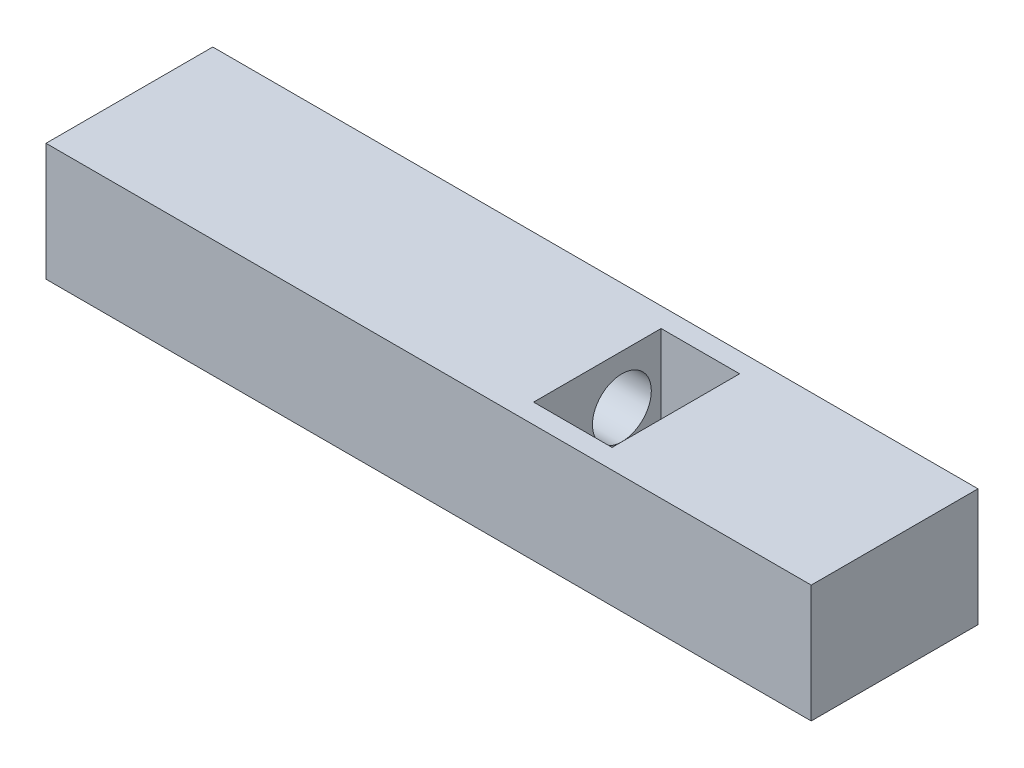
ISO-10303-21;
HEADER;
FILE_DESCRIPTION(('STEP AP214'),'2;1');
FILE_NAME('part.step','',(''),(''),'','','');
FILE_SCHEMA(('AUTOMOTIVE_DESIGN { 1 0 10303 214 1 1 1 1 }'));
ENDSEC;
DATA;
#1=APPLICATION_CONTEXT('core data for automotive mechanical design processes');
#2=APPLICATION_PROTOCOL_DEFINITION('international standard','automotive_design',2000,#1);
#3=PRODUCT_CONTEXT('',#1,'mechanical');
#4=PRODUCT('Part','Part','',(#3));
#5=PRODUCT_RELATED_PRODUCT_CATEGORY('part','',(#4));
#6=PRODUCT_DEFINITION_FORMATION('','',#4);
#7=PRODUCT_DEFINITION_CONTEXT('part definition',#1,'design');
#8=PRODUCT_DEFINITION('design','',#6,#7);
#9=PRODUCT_DEFINITION_SHAPE('','',#8);
#10=(LENGTH_UNIT() NAMED_UNIT(*) SI_UNIT(.MILLI.,.METRE.));
#11=(NAMED_UNIT(*) PLANE_ANGLE_UNIT() SI_UNIT($,.RADIAN.));
#12=(NAMED_UNIT(*) SI_UNIT($,.STERADIAN.) SOLID_ANGLE_UNIT());
#13=UNCERTAINTY_MEASURE_WITH_UNIT(LENGTH_MEASURE(1.E-05),#10,'distance_accuracy_value','');
#14=(GEOMETRIC_REPRESENTATION_CONTEXT(3) GLOBAL_UNCERTAINTY_ASSIGNED_CONTEXT((#13)) GLOBAL_UNIT_ASSIGNED_CONTEXT((#10,
#11,#12)) REPRESENTATION_CONTEXT('',''));
#15=CARTESIAN_POINT('',(0.,0.,0.));
#16=DIRECTION('',(0.,0.,1.));
#17=DIRECTION('',(1.,0.,0.));
#18=AXIS2_PLACEMENT_3D('',#15,#16,#17);
#19=CARTESIAN_POINT('',(0.,6.,0.));
#20=DIRECTION('',(1.,0.,0.));
#21=DIRECTION('',(0.,0.,1.));
#22=AXIS2_PLACEMENT_3D('',#19,#20,#21);
#23=PLANE('',#22);
#24=DIRECTION('',(0.,0.,-1.));
#25=VECTOR('',#24,1.);
#26=CARTESIAN_POINT('',(0.,0.,0.));
#27=LINE('',#26,#25);
#28=CARTESIAN_POINT('',(0.,0.,8.5));
#29=VERTEX_POINT('',#28);
#30=CARTESIAN_POINT('',(0.,0.,0.));
#31=VERTEX_POINT('',#30);
#32=EDGE_CURVE('E154',#29,#31,#27,.T.);
#33=ORIENTED_EDGE('',*,*,#32,.F.);
#34=DIRECTION('',(0.,-1.,0.));
#35=VECTOR('',#34,1.);
#36=CARTESIAN_POINT('',(0.,6.,8.5));
#37=LINE('',#36,#35);
#38=CARTESIAN_POINT('',(0.,6.,8.5));
#39=VERTEX_POINT('',#38);
#40=EDGE_CURVE('E164',#39,#29,#37,.T.);
#41=ORIENTED_EDGE('',*,*,#40,.F.);
#42=DIRECTION('',(0.,0.,-1.));
#43=VECTOR('',#42,1.);
#44=CARTESIAN_POINT('',(0.,6.,0.));
#45=LINE('',#44,#43);
#46=CARTESIAN_POINT('',(0.,6.,0.));
#47=VERTEX_POINT('',#46);
#48=EDGE_CURVE('E156',#39,#47,#45,.T.);
#49=ORIENTED_EDGE('',*,*,#48,.T.);
#50=DIRECTION('',(0.,-1.,0.));
#51=VECTOR('',#50,1.);
#52=CARTESIAN_POINT('',(0.,6.,0.));
#53=LINE('',#52,#51);
#54=EDGE_CURVE('E11',#47,#31,#53,.T.);
#55=ORIENTED_EDGE('',*,*,#54,.T.);
#56=EDGE_LOOP('',(#33,#41,#49,#55));
#57=FACE_BOUND('',#56,.T.);
#58=ADVANCED_FACE('F45',(#57),#23,.F.);
#59=CARTESIAN_POINT('',(0.,6.,0.));
#60=DIRECTION('',(0.,0.,1.));
#61=DIRECTION('',(-1.,0.,0.));
#62=AXIS2_PLACEMENT_3D('',#59,#60,#61);
#63=PLANE('',#62);
#64=DIRECTION('',(1.,0.,0.));
#65=VECTOR('',#64,1.);
#66=CARTESIAN_POINT('',(0.,0.,0.));
#67=LINE('',#66,#65);
#68=CARTESIAN_POINT('',(39.,0.,0.));
#69=VERTEX_POINT('',#68);
#70=EDGE_CURVE('E166',#31,#69,#67,.T.);
#71=ORIENTED_EDGE('',*,*,#70,.F.);
#72=ORIENTED_EDGE('',*,*,#54,.F.);
#73=DIRECTION('',(1.,0.,0.));
#74=VECTOR('',#73,1.);
#75=CARTESIAN_POINT('',(0.,6.,0.));
#76=LINE('',#75,#74);
#77=CARTESIAN_POINT('',(39.,6.,0.));
#78=VERTEX_POINT('',#77);
#79=EDGE_CURVE('E96',#47,#78,#76,.T.);
#80=ORIENTED_EDGE('',*,*,#79,.T.);
#81=DIRECTION('',(0.,-1.,0.));
#82=VECTOR('',#81,1.);
#83=CARTESIAN_POINT('',(39.,6.,0.));
#84=LINE('',#83,#82);
#85=EDGE_CURVE('E53',#78,#69,#84,.T.);
#86=ORIENTED_EDGE('',*,*,#85,.T.);
#87=EDGE_LOOP('',(#71,#72,#80,#86));
#88=FACE_BOUND('',#87,.T.);
#89=ADVANCED_FACE('F179',(#88),#63,.F.);
#90=CARTESIAN_POINT('',(39.,6.,0.));
#91=DIRECTION('',(-1.,0.,0.));
#92=DIRECTION('',(0.,0.,-1.));
#93=AXIS2_PLACEMENT_3D('',#90,#91,#92);
#94=PLANE('',#93);
#95=DIRECTION('',(0.,0.,1.));
#96=VECTOR('',#95,1.);
#97=CARTESIAN_POINT('',(39.,0.,0.));
#98=LINE('',#97,#96);
#99=CARTESIAN_POINT('',(39.,0.,8.5));
#100=VERTEX_POINT('',#99);
#101=EDGE_CURVE('E169',#69,#100,#98,.T.);
#102=ORIENTED_EDGE('',*,*,#101,.F.);
#103=ORIENTED_EDGE('',*,*,#85,.F.);
#104=DIRECTION('',(0.,0.,1.));
#105=VECTOR('',#104,1.);
#106=CARTESIAN_POINT('',(39.,6.,0.));
#107=LINE('',#106,#105);
#108=CARTESIAN_POINT('',(39.,6.,8.5));
#109=VERTEX_POINT('',#108);
#110=EDGE_CURVE('E160',#78,#109,#107,.T.);
#111=ORIENTED_EDGE('',*,*,#110,.T.);
#112=DIRECTION('',(0.,-1.,0.));
#113=VECTOR('',#112,1.);
#114=CARTESIAN_POINT('',(39.,6.,8.5));
#115=LINE('',#114,#113);
#116=EDGE_CURVE('E173',#109,#100,#115,.T.);
#117=ORIENTED_EDGE('',*,*,#116,.T.);
#118=EDGE_LOOP('',(#102,#103,#111,#117));
#119=FACE_BOUND('',#118,.T.);
#120=ADVANCED_FACE('F186',(#119),#94,.F.);
#121=CARTESIAN_POINT('',(0.,6.,8.5));
#122=DIRECTION('',(0.,0.,-1.));
#123=DIRECTION('',(1.,0.,0.));
#124=AXIS2_PLACEMENT_3D('',#121,#122,#123);
#125=PLANE('',#124);
#126=DIRECTION('',(-1.,0.,0.));
#127=VECTOR('',#126,1.);
#128=CARTESIAN_POINT('',(0.,0.,8.5));
#129=LINE('',#128,#127);
#130=EDGE_CURVE('E90',#100,#29,#129,.T.);
#131=ORIENTED_EDGE('',*,*,#130,.F.);
#132=ORIENTED_EDGE('',*,*,#116,.F.);
#133=DIRECTION('',(-1.,0.,0.));
#134=VECTOR('',#133,1.);
#135=CARTESIAN_POINT('',(0.,6.,8.5));
#136=LINE('',#135,#134);
#137=EDGE_CURVE('E69',#109,#39,#136,.T.);
#138=ORIENTED_EDGE('',*,*,#137,.T.);
#139=ORIENTED_EDGE('',*,*,#40,.T.);
#140=EDGE_LOOP('',(#131,#132,#138,#139));
#141=FACE_BOUND('',#140,.T.);
#142=ADVANCED_FACE('F185',(#141),#125,.F.);
#143=CARTESIAN_POINT('',(0.,6.,0.));
#144=DIRECTION('',(0.,-1.,0.));
#145=DIRECTION('',(0.,0.,1.));
#146=AXIS2_PLACEMENT_3D('',#143,#144,#145);
#147=PLANE('',#146);
#148=DIRECTION('',(0.,0.,-1.));
#149=VECTOR('',#148,1.);
#150=CARTESIAN_POINT('',(23.85,6.,5.));
#151=LINE('',#150,#149);
#152=CARTESIAN_POINT('',(23.85,6.,7.5));
#153=VERTEX_POINT('',#152);
#154=CARTESIAN_POINT('',(23.85,6.,1.));
#155=VERTEX_POINT('',#154);
#156=EDGE_CURVE('E135',#153,#155,#151,.T.);
#157=ORIENTED_EDGE('',*,*,#156,.T.);
#158=DIRECTION('',(1.,0.,0.));
#159=VECTOR('',#158,1.);
#160=CARTESIAN_POINT('',(23.85,6.,1.));
#161=LINE('',#160,#159);
#162=CARTESIAN_POINT('',(27.85,6.,1.));
#163=VERTEX_POINT('',#162);
#164=EDGE_CURVE('E141',#155,#163,#161,.T.);
#165=ORIENTED_EDGE('',*,*,#164,.T.);
#166=DIRECTION('',(0.,0.,1.));
#167=VECTOR('',#166,1.);
#168=CARTESIAN_POINT('',(27.85,6.,5.));
#169=LINE('',#168,#167);
#170=CARTESIAN_POINT('',(27.85,6.,7.5));
#171=VERTEX_POINT('',#170);
#172=EDGE_CURVE('E137',#163,#171,#169,.T.);
#173=ORIENTED_EDGE('',*,*,#172,.T.);
#174=DIRECTION('',(1.,0.,0.));
#175=VECTOR('',#174,1.);
#176=CARTESIAN_POINT('',(23.85,6.,7.5));
#177=LINE('',#176,#175);
#178=EDGE_CURVE('E125',#153,#171,#177,.T.);
#179=ORIENTED_EDGE('',*,*,#178,.F.);
#180=EDGE_LOOP('',(#157,#165,#173,#179));
#181=FACE_BOUND('',#180,.T.);
#182=ORIENTED_EDGE('',*,*,#48,.F.);
#183=ORIENTED_EDGE('',*,*,#137,.F.);
#184=ORIENTED_EDGE('',*,*,#110,.F.);
#185=ORIENTED_EDGE('',*,*,#79,.F.);
#186=EDGE_LOOP('',(#182,#183,#184,#185));
#187=FACE_BOUND('',#186,.T.);
#188=ADVANCED_FACE('F133',(#181,#187),#147,.F.);
#189=CARTESIAN_POINT('',(0.,0.,0.));
#190=DIRECTION('',(0.,-1.,0.));
#191=DIRECTION('',(0.,0.,1.));
#192=AXIS2_PLACEMENT_3D('',#189,#190,#191);
#193=PLANE('',#192);
#194=ORIENTED_EDGE('',*,*,#32,.T.);
#195=ORIENTED_EDGE('',*,*,#70,.T.);
#196=ORIENTED_EDGE('',*,*,#101,.T.);
#197=ORIENTED_EDGE('',*,*,#130,.T.);
#198=EDGE_LOOP('',(#194,#195,#196,#197));
#199=FACE_BOUND('',#198,.T.);
#200=ADVANCED_FACE('F181',(#199),#193,.T.);
#201=CARTESIAN_POINT('',(23.85,1.,5.));
#202=DIRECTION('',(-1.,0.,0.));
#203=DIRECTION('',(0.,0.,-1.));
#204=AXIS2_PLACEMENT_3D('',#201,#202,#203);
#205=PLANE('',#204);
#206=CARTESIAN_POINT('',(23.85,3.5,3.));
#207=DIRECTION('',(1.,0.,0.));
#208=DIRECTION('',(0.,0.,-1.));
#209=AXIS2_PLACEMENT_3D('',#206,#207,#208);
#210=CIRCLE('',#209,1.5);
#211=CARTESIAN_POINT('',(23.85,3.5,1.5));
#212=VERTEX_POINT('',#211);
#213=EDGE_CURVE('E142',#212,#212,#210,.F.);
#214=ORIENTED_EDGE('',*,*,#213,.T.);
#215=EDGE_LOOP('',(#214));
#216=FACE_BOUND('',#215,.T.);
#217=ORIENTED_EDGE('',*,*,#156,.F.);
#218=DIRECTION('',(0.,-0.894427190999916,-0.447213595499958));
#219=VECTOR('',#218,1.);
#220=CARTESIAN_POINT('',(23.85,6.,7.5));
#221=LINE('',#220,#219);
#222=CARTESIAN_POINT('',(23.85,1.,5.));
#223=VERTEX_POINT('',#222);
#224=EDGE_CURVE('E121',#153,#223,#221,.T.);
#225=ORIENTED_EDGE('',*,*,#224,.T.);
#226=DIRECTION('',(0.,0.,-1.));
#227=VECTOR('',#226,1.);
#228=CARTESIAN_POINT('',(23.85,1.,5.));
#229=LINE('',#228,#227);
#230=CARTESIAN_POINT('',(23.85,1.,1.));
#231=VERTEX_POINT('',#230);
#232=EDGE_CURVE('E151',#223,#231,#229,.T.);
#233=ORIENTED_EDGE('',*,*,#232,.T.);
#234=DIRECTION('',(0.,1.,0.));
#235=VECTOR('',#234,1.);
#236=CARTESIAN_POINT('',(23.85,1.,1.));
#237=LINE('',#236,#235);
#238=EDGE_CURVE('E60',#231,#155,#237,.T.);
#239=ORIENTED_EDGE('',*,*,#238,.T.);
#240=EDGE_LOOP('',(#217,#225,#233,#239));
#241=FACE_BOUND('',#240,.T.);
#242=ADVANCED_FACE('F140',(#216,#241),#205,.F.);
#243=CARTESIAN_POINT('',(27.85,1.,5.));
#244=DIRECTION('',(1.,0.,0.));
#245=DIRECTION('',(0.,0.,1.));
#246=AXIS2_PLACEMENT_3D('',#243,#244,#245);
#247=PLANE('',#246);
#248=CARTESIAN_POINT('',(27.85,3.5,3.));
#249=DIRECTION('',(-1.,0.,0.));
#250=DIRECTION('',(0.,0.,1.));
#251=AXIS2_PLACEMENT_3D('',#248,#249,#250);
#252=CIRCLE('',#251,1.5);
#253=CARTESIAN_POINT('',(27.85,3.5,4.5));
#254=VERTEX_POINT('',#253);
#255=EDGE_CURVE('E48',#254,#254,#252,.F.);
#256=ORIENTED_EDGE('',*,*,#255,.T.);
#257=EDGE_LOOP('',(#256));
#258=FACE_BOUND('',#257,.T.);
#259=ORIENTED_EDGE('',*,*,#172,.F.);
#260=DIRECTION('',(0.,1.,0.));
#261=VECTOR('',#260,1.);
#262=CARTESIAN_POINT('',(27.85,1.,1.));
#263=LINE('',#262,#261);
#264=CARTESIAN_POINT('',(27.85,1.,1.));
#265=VERTEX_POINT('',#264);
#266=EDGE_CURVE('E152',#265,#163,#263,.T.);
#267=ORIENTED_EDGE('',*,*,#266,.F.);
#268=DIRECTION('',(0.,0.,1.));
#269=VECTOR('',#268,1.);
#270=CARTESIAN_POINT('',(27.85,1.,5.));
#271=LINE('',#270,#269);
#272=CARTESIAN_POINT('',(27.85,1.,5.));
#273=VERTEX_POINT('',#272);
#274=EDGE_CURVE('E334',#265,#273,#271,.T.);
#275=ORIENTED_EDGE('',*,*,#274,.T.);
#276=DIRECTION('',(0.,-0.894427190999916,-0.447213595499958));
#277=VECTOR('',#276,1.);
#278=CARTESIAN_POINT('',(27.85,6.,7.5));
#279=LINE('',#278,#277);
#280=EDGE_CURVE('E129',#171,#273,#279,.T.);
#281=ORIENTED_EDGE('',*,*,#280,.F.);
#282=EDGE_LOOP('',(#259,#267,#275,#281));
#283=FACE_BOUND('',#282,.T.);
#284=ADVANCED_FACE('F239',(#258,#283),#247,.F.);
#285=CARTESIAN_POINT('',(23.85,1.,1.));
#286=DIRECTION('',(0.,0.,-1.));
#287=DIRECTION('',(1.,0.,0.));
#288=AXIS2_PLACEMENT_3D('',#285,#286,#287);
#289=PLANE('',#288);
#290=ORIENTED_EDGE('',*,*,#164,.F.);
#291=ORIENTED_EDGE('',*,*,#238,.F.);
#292=DIRECTION('',(1.,0.,0.));
#293=VECTOR('',#292,1.);
#294=CARTESIAN_POINT('',(23.85,1.,1.));
#295=LINE('',#294,#293);
#296=EDGE_CURVE('E333',#231,#265,#295,.T.);
#297=ORIENTED_EDGE('',*,*,#296,.T.);
#298=ORIENTED_EDGE('',*,*,#266,.T.);
#299=EDGE_LOOP('',(#290,#291,#297,#298));
#300=FACE_BOUND('',#299,.T.);
#301=ADVANCED_FACE('F253',(#300),#289,.F.);
#302=CARTESIAN_POINT('',(0.,1.,0.));
#303=DIRECTION('',(0.,1.,0.));
#304=DIRECTION('',(0.,0.,-1.));
#305=AXIS2_PLACEMENT_3D('',#302,#303,#304);
#306=PLANE('',#305);
#307=ORIENTED_EDGE('',*,*,#232,.F.);
#308=DIRECTION('',(-1.,0.,0.));
#309=VECTOR('',#308,1.);
#310=CARTESIAN_POINT('',(23.85,1.,5.));
#311=LINE('',#310,#309);
#312=EDGE_CURVE('E127',#273,#223,#311,.T.);
#313=ORIENTED_EDGE('',*,*,#312,.F.);
#314=ORIENTED_EDGE('',*,*,#274,.F.);
#315=ORIENTED_EDGE('',*,*,#296,.F.);
#316=EDGE_LOOP('',(#307,#313,#314,#315));
#317=FACE_BOUND('',#316,.T.);
#318=ADVANCED_FACE('F266',(#317),#306,.T.);
#319=CARTESIAN_POINT('',(31.85,0.,0.));
#320=DIRECTION('',(-1.,0.,0.));
#321=DIRECTION('',(0.,0.,-1.));
#322=AXIS2_PLACEMENT_3D('',#319,#320,#321);
#323=PLANE('',#322);
#324=CARTESIAN_POINT('',(31.85,3.5,3.));
#325=DIRECTION('',(1.,0.,0.));
#326=DIRECTION('',(0.,0.,-1.));
#327=AXIS2_PLACEMENT_3D('',#324,#325,#326);
#328=CIRCLE('',#327,1.5);
#329=CARTESIAN_POINT('',(31.85,3.5,1.5));
#330=VERTEX_POINT('',#329);
#331=EDGE_CURVE('E138',#330,#330,#328,.T.);
#332=ORIENTED_EDGE('',*,*,#331,.F.);
#333=EDGE_LOOP('',(#332));
#334=FACE_BOUND('',#333,.T.);
#335=ADVANCED_FACE('F276',(#334),#323,.T.);
#336=CARTESIAN_POINT('',(19.85,3.5,3.));
#337=DIRECTION('',(1.,0.,0.));
#338=DIRECTION('',(0.,0.,1.));
#339=AXIS2_PLACEMENT_3D('',#336,#337,#338);
#340=CYLINDRICAL_SURFACE('',#339,1.5);
#341=ORIENTED_EDGE('',*,*,#331,.T.);
#342=EDGE_LOOP('',(#341));
#343=FACE_BOUND('',#342,.T.);
#344=ORIENTED_EDGE('',*,*,#255,.F.);
#345=EDGE_LOOP('',(#344));
#346=FACE_BOUND('',#345,.T.);
#347=ADVANCED_FACE('F286',(#343,#346),#340,.F.);
#348=CARTESIAN_POINT('',(19.85,3.5,3.));
#349=DIRECTION('',(1.,0.,0.));
#350=DIRECTION('',(0.,0.,-1.));
#351=AXIS2_PLACEMENT_3D('',#348,#349,#350);
#352=CIRCLE('',#351,1.5);
#353=CARTESIAN_POINT('',(19.85,3.5,1.5));
#354=VERTEX_POINT('',#353);
#355=EDGE_CURVE('E326',#354,#354,#352,.T.);
#356=ORIENTED_EDGE('',*,*,#355,.F.);
#357=EDGE_LOOP('',(#356));
#358=FACE_BOUND('',#357,.T.);
#359=ORIENTED_EDGE('',*,*,#213,.F.);
#360=EDGE_LOOP('',(#359));
#361=FACE_BOUND('',#360,.T.);
#362=ADVANCED_FACE('F296',(#358,#361),#340,.F.);
#363=CARTESIAN_POINT('',(19.85,0.,0.));
#364=DIRECTION('',(-1.,0.,0.));
#365=DIRECTION('',(0.,0.,-1.));
#366=AXIS2_PLACEMENT_3D('',#363,#364,#365);
#367=PLANE('',#366);
#368=ORIENTED_EDGE('',*,*,#355,.T.);
#369=EDGE_LOOP('',(#368));
#370=FACE_BOUND('',#369,.T.);
#371=ADVANCED_FACE('F306',(#370),#367,.F.);
#372=CARTESIAN_POINT('',(23.85,6.,7.5));
#373=DIRECTION('',(0.,0.447213595499958,-0.894427190999916));
#374=DIRECTION('',(0.,-0.894427190999916,-0.447213595499958));
#375=AXIS2_PLACEMENT_3D('',#372,#373,#374);
#376=PLANE('',#375);
#377=ORIENTED_EDGE('',*,*,#280,.T.);
#378=ORIENTED_EDGE('',*,*,#312,.T.);
#379=ORIENTED_EDGE('',*,*,#224,.F.);
#380=ORIENTED_EDGE('',*,*,#178,.T.);
#381=EDGE_LOOP('',(#377,#378,#379,#380));
#382=FACE_BOUND('',#381,.T.);
#383=ADVANCED_FACE('F124',(#382),#376,.T.);
#384=CLOSED_SHELL('',(#58,#89,#120,#142,#188,#200,#242,#284,#301,#318,#335,#347,#362,#371,#383));
#385=MANIFOLD_SOLID_BREP('B2',#384);
#386=ADVANCED_BREP_SHAPE_REPRESENTATION('',(#18,#385),#14);
#387=SHAPE_DEFINITION_REPRESENTATION(#9,#386);
ENDSEC;
END-ISO-10303-21;
